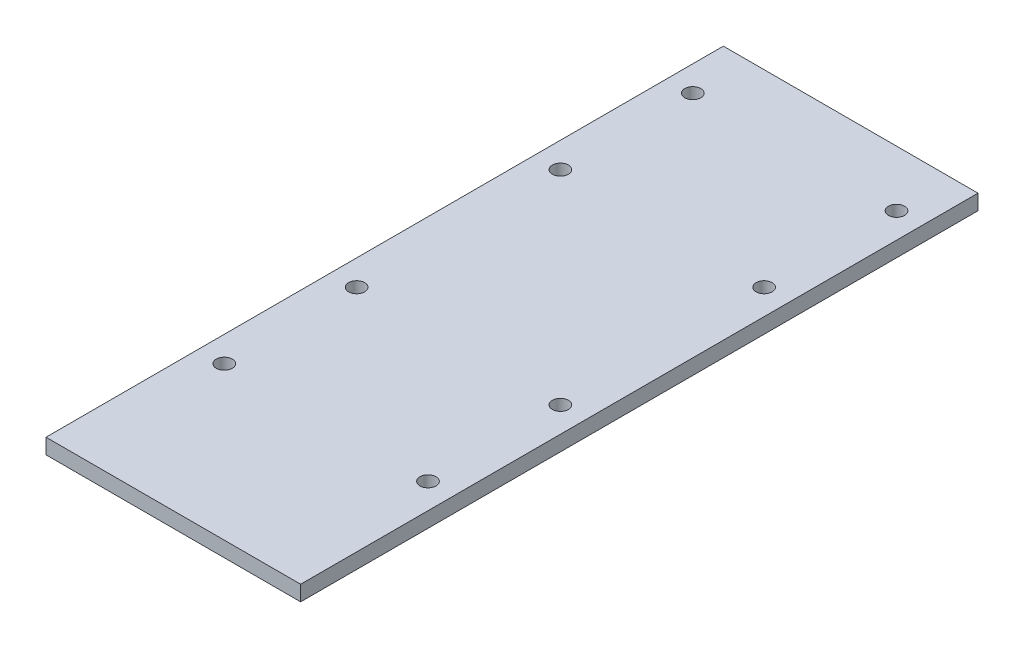
ISO-10303-21;
HEADER;
FILE_DESCRIPTION(('STEP AP214'),'2;1');
FILE_NAME('part.step','',(''),(''),'','','');
FILE_SCHEMA(('AUTOMOTIVE_DESIGN { 1 0 10303 214 1 1 1 1 }'));
ENDSEC;
DATA;
#1=APPLICATION_CONTEXT('core data for automotive mechanical design processes');
#2=APPLICATION_PROTOCOL_DEFINITION('international standard','automotive_design',2000,#1);
#3=PRODUCT_CONTEXT('',#1,'mechanical');
#4=PRODUCT('Part','Part','',(#3));
#5=PRODUCT_RELATED_PRODUCT_CATEGORY('part','',(#4));
#6=PRODUCT_DEFINITION_FORMATION('','',#4);
#7=PRODUCT_DEFINITION_CONTEXT('part definition',#1,'design');
#8=PRODUCT_DEFINITION('design','',#6,#7);
#9=PRODUCT_DEFINITION_SHAPE('','',#8);
#10=(LENGTH_UNIT() NAMED_UNIT(*) SI_UNIT(.MILLI.,.METRE.));
#11=(NAMED_UNIT(*) PLANE_ANGLE_UNIT() SI_UNIT($,.RADIAN.));
#12=(NAMED_UNIT(*) SI_UNIT($,.STERADIAN.) SOLID_ANGLE_UNIT());
#13=UNCERTAINTY_MEASURE_WITH_UNIT(LENGTH_MEASURE(1.E-05),#10,'distance_accuracy_value','');
#14=(GEOMETRIC_REPRESENTATION_CONTEXT(3) GLOBAL_UNCERTAINTY_ASSIGNED_CONTEXT((#13)) GLOBAL_UNIT_ASSIGNED_CONTEXT((#10,
#11,#12)) REPRESENTATION_CONTEXT('',''));
#15=CARTESIAN_POINT('',(0.,0.,0.));
#16=DIRECTION('',(0.,0.,1.));
#17=DIRECTION('',(1.,0.,0.));
#18=AXIS2_PLACEMENT_3D('',#15,#16,#17);
#19=CARTESIAN_POINT('',(0.,3.,0.));
#20=DIRECTION('',(0.,1.,0.));
#21=DIRECTION('',(0.,0.,1.));
#22=AXIS2_PLACEMENT_3D('',#19,#20,#21);
#23=PLANE('',#22);
#24=CARTESIAN_POINT('',(-20.,3.,-55.5));
#25=DIRECTION('',(0.,1.,0.));
#26=DIRECTION('',(0.,0.,1.));
#27=AXIS2_PLACEMENT_3D('',#24,#25,#26);
#28=CIRCLE('',#27,1.575);
#29=CARTESIAN_POINT('',(-20.,3.,-53.925));
#30=VERTEX_POINT('',#29);
#31=EDGE_CURVE('E148',#30,#30,#28,.T.);
#32=ORIENTED_EDGE('',*,*,#31,.F.);
#33=EDGE_LOOP('',(#32));
#34=FACE_BOUND('',#33,.T.);
#35=CARTESIAN_POINT('',(20.,3.,-29.5));
#36=DIRECTION('',(0.,1.,0.));
#37=DIRECTION('',(0.,0.,1.));
#38=AXIS2_PLACEMENT_3D('',#35,#36,#37);
#39=CIRCLE('',#38,1.575);
#40=CARTESIAN_POINT('',(20.,3.,-27.925));
#41=VERTEX_POINT('',#40);
#42=EDGE_CURVE('E136',#41,#41,#39,.T.);
#43=ORIENTED_EDGE('',*,*,#42,.F.);
#44=EDGE_LOOP('',(#43));
#45=FACE_BOUND('',#44,.T.);
#46=CARTESIAN_POINT('',(20.,3.,36.5));
#47=DIRECTION('',(0.,1.,0.));
#48=DIRECTION('',(0.,0.,1.));
#49=AXIS2_PLACEMENT_3D('',#46,#47,#48);
#50=CIRCLE('',#49,1.575);
#51=CARTESIAN_POINT('',(20.,3.,38.075));
#52=VERTEX_POINT('',#51);
#53=EDGE_CURVE('E124',#52,#52,#50,.T.);
#54=ORIENTED_EDGE('',*,*,#53,.F.);
#55=EDGE_LOOP('',(#54));
#56=FACE_BOUND('',#55,.T.);
#57=CARTESIAN_POINT('',(-20.,3.,10.5));
#58=DIRECTION('',(0.,1.,0.));
#59=DIRECTION('',(0.,0.,1.));
#60=AXIS2_PLACEMENT_3D('',#57,#58,#59);
#61=CIRCLE('',#60,1.575);
#62=CARTESIAN_POINT('',(-20.,3.,12.075));
#63=VERTEX_POINT('',#62);
#64=EDGE_CURVE('E103',#63,#63,#61,.T.);
#65=ORIENTED_EDGE('',*,*,#64,.F.);
#66=EDGE_LOOP('',(#65));
#67=FACE_BOUND('',#66,.T.);
#68=DIRECTION('',(0.,0.,-1.));
#69=VECTOR('',#68,1.);
#70=CARTESIAN_POINT('',(25.,3.,-66.5));
#71=LINE('',#70,#69);
#72=CARTESIAN_POINT('',(25.,3.,66.5));
#73=VERTEX_POINT('',#72);
#74=CARTESIAN_POINT('',(25.,3.,-66.5));
#75=VERTEX_POINT('',#74);
#76=EDGE_CURVE('E88',#73,#75,#71,.T.);
#77=ORIENTED_EDGE('',*,*,#76,.T.);
#78=DIRECTION('',(-1.,0.,0.));
#79=VECTOR('',#78,1.);
#80=CARTESIAN_POINT('',(-25.,3.,-66.5));
#81=LINE('',#80,#79);
#82=CARTESIAN_POINT('',(-25.,3.,-66.5));
#83=VERTEX_POINT('',#82);
#84=EDGE_CURVE('E83',#75,#83,#81,.T.);
#85=ORIENTED_EDGE('',*,*,#84,.T.);
#86=DIRECTION('',(0.,0.,1.));
#87=VECTOR('',#86,1.);
#88=CARTESIAN_POINT('',(-25.,3.,-66.5));
#89=LINE('',#88,#87);
#90=CARTESIAN_POINT('',(-25.,3.,66.5));
#91=VERTEX_POINT('',#90);
#92=EDGE_CURVE('E86',#83,#91,#89,.T.);
#93=ORIENTED_EDGE('',*,*,#92,.T.);
#94=DIRECTION('',(1.,0.,0.));
#95=VECTOR('',#94,1.);
#96=CARTESIAN_POINT('',(-25.,3.,66.5));
#97=LINE('',#96,#95);
#98=EDGE_CURVE('E53',#91,#73,#97,.T.);
#99=ORIENTED_EDGE('',*,*,#98,.T.);
#100=EDGE_LOOP('',(#77,#85,#93,#99));
#101=FACE_BOUND('',#100,.T.);
#102=CARTESIAN_POINT('',(-20.,3.,36.5));
#103=DIRECTION('',(0.,1.,0.));
#104=DIRECTION('',(0.,0.,1.));
#105=AXIS2_PLACEMENT_3D('',#102,#103,#104);
#106=CIRCLE('',#105,1.575);
#107=CARTESIAN_POINT('',(-20.,3.,38.075));
#108=VERTEX_POINT('',#107);
#109=EDGE_CURVE('E118',#108,#108,#106,.T.);
#110=ORIENTED_EDGE('',*,*,#109,.F.);
#111=EDGE_LOOP('',(#110));
#112=FACE_BOUND('',#111,.T.);
#113=CARTESIAN_POINT('',(20.,3.,10.5));
#114=DIRECTION('',(0.,1.,0.));
#115=DIRECTION('',(0.,0.,1.));
#116=AXIS2_PLACEMENT_3D('',#113,#114,#115);
#117=CIRCLE('',#116,1.575);
#118=CARTESIAN_POINT('',(20.,3.,12.075));
#119=VERTEX_POINT('',#118);
#120=EDGE_CURVE('E130',#119,#119,#117,.T.);
#121=ORIENTED_EDGE('',*,*,#120,.F.);
#122=EDGE_LOOP('',(#121));
#123=FACE_BOUND('',#122,.T.);
#124=CARTESIAN_POINT('',(-20.,3.,-29.5));
#125=DIRECTION('',(0.,1.,0.));
#126=DIRECTION('',(0.,0.,1.));
#127=AXIS2_PLACEMENT_3D('',#124,#125,#126);
#128=CIRCLE('',#127,1.575);
#129=CARTESIAN_POINT('',(-20.,3.,-27.925));
#130=VERTEX_POINT('',#129);
#131=EDGE_CURVE('E142',#130,#130,#128,.T.);
#132=ORIENTED_EDGE('',*,*,#131,.F.);
#133=EDGE_LOOP('',(#132));
#134=FACE_BOUND('',#133,.T.);
#135=CARTESIAN_POINT('',(20.,3.,-55.5));
#136=DIRECTION('',(0.,1.,0.));
#137=DIRECTION('',(0.,0.,1.));
#138=AXIS2_PLACEMENT_3D('',#135,#136,#137);
#139=CIRCLE('',#138,1.575);
#140=CARTESIAN_POINT('',(20.,3.,-53.925));
#141=VERTEX_POINT('',#140);
#142=EDGE_CURVE('E154',#141,#141,#139,.T.);
#143=ORIENTED_EDGE('',*,*,#142,.F.);
#144=EDGE_LOOP('',(#143));
#145=FACE_BOUND('',#144,.T.);
#146=ADVANCED_FACE('F36',(#34,#45,#56,#67,#101,#112,#123,#134,#145),#23,.T.);
#147=CARTESIAN_POINT('',(0.,0.,0.));
#148=DIRECTION('',(0.,1.,0.));
#149=DIRECTION('',(0.,0.,1.));
#150=AXIS2_PLACEMENT_3D('',#147,#148,#149);
#151=PLANE('',#150);
#152=DIRECTION('',(0.,0.,-1.));
#153=VECTOR('',#152,1.);
#154=CARTESIAN_POINT('',(25.,0.,-66.5));
#155=LINE('',#154,#153);
#156=CARTESIAN_POINT('',(25.,0.,66.5));
#157=VERTEX_POINT('',#156);
#158=CARTESIAN_POINT('',(25.,0.,-66.5));
#159=VERTEX_POINT('',#158);
#160=EDGE_CURVE('E100',#157,#159,#155,.T.);
#161=ORIENTED_EDGE('',*,*,#160,.F.);
#162=DIRECTION('',(1.,0.,0.));
#163=VECTOR('',#162,1.);
#164=CARTESIAN_POINT('',(-25.,0.,66.5));
#165=LINE('',#164,#163);
#166=CARTESIAN_POINT('',(-25.,0.,66.5));
#167=VERTEX_POINT('',#166);
#168=EDGE_CURVE('E76',#167,#157,#165,.T.);
#169=ORIENTED_EDGE('',*,*,#168,.F.);
#170=DIRECTION('',(0.,0.,1.));
#171=VECTOR('',#170,1.);
#172=CARTESIAN_POINT('',(-25.,0.,-66.5));
#173=LINE('',#172,#171);
#174=CARTESIAN_POINT('',(-25.,0.,-66.5));
#175=VERTEX_POINT('',#174);
#176=EDGE_CURVE('E70',#175,#167,#173,.T.);
#177=ORIENTED_EDGE('',*,*,#176,.F.);
#178=DIRECTION('',(-1.,0.,0.));
#179=VECTOR('',#178,1.);
#180=CARTESIAN_POINT('',(-25.,0.,-66.5));
#181=LINE('',#180,#179);
#182=EDGE_CURVE('E92',#159,#175,#181,.T.);
#183=ORIENTED_EDGE('',*,*,#182,.F.);
#184=EDGE_LOOP('',(#161,#169,#177,#183));
#185=FACE_BOUND('',#184,.T.);
#186=CARTESIAN_POINT('',(-20.,0.,10.5));
#187=DIRECTION('',(0.,1.,0.));
#188=DIRECTION('',(0.,0.,1.));
#189=AXIS2_PLACEMENT_3D('',#186,#187,#188);
#190=CIRCLE('',#189,1.575);
#191=CARTESIAN_POINT('',(-20.,0.,12.075));
#192=VERTEX_POINT('',#191);
#193=EDGE_CURVE('E115',#192,#192,#190,.T.);
#194=ORIENTED_EDGE('',*,*,#193,.T.);
#195=EDGE_LOOP('',(#194));
#196=FACE_BOUND('',#195,.T.);
#197=CARTESIAN_POINT('',(-20.,0.,36.5));
#198=DIRECTION('',(0.,1.,0.));
#199=DIRECTION('',(0.,0.,1.));
#200=AXIS2_PLACEMENT_3D('',#197,#198,#199);
#201=CIRCLE('',#200,1.575);
#202=CARTESIAN_POINT('',(-20.,0.,38.075));
#203=VERTEX_POINT('',#202);
#204=EDGE_CURVE('E121',#203,#203,#201,.T.);
#205=ORIENTED_EDGE('',*,*,#204,.T.);
#206=EDGE_LOOP('',(#205));
#207=FACE_BOUND('',#206,.T.);
#208=CARTESIAN_POINT('',(20.,0.,36.5));
#209=DIRECTION('',(0.,1.,0.));
#210=DIRECTION('',(0.,0.,1.));
#211=AXIS2_PLACEMENT_3D('',#208,#209,#210);
#212=CIRCLE('',#211,1.575);
#213=CARTESIAN_POINT('',(20.,0.,38.075));
#214=VERTEX_POINT('',#213);
#215=EDGE_CURVE('E127',#214,#214,#212,.T.);
#216=ORIENTED_EDGE('',*,*,#215,.T.);
#217=EDGE_LOOP('',(#216));
#218=FACE_BOUND('',#217,.T.);
#219=CARTESIAN_POINT('',(20.,0.,10.5));
#220=DIRECTION('',(0.,1.,0.));
#221=DIRECTION('',(0.,0.,1.));
#222=AXIS2_PLACEMENT_3D('',#219,#220,#221);
#223=CIRCLE('',#222,1.575);
#224=CARTESIAN_POINT('',(20.,0.,12.075));
#225=VERTEX_POINT('',#224);
#226=EDGE_CURVE('E133',#225,#225,#223,.T.);
#227=ORIENTED_EDGE('',*,*,#226,.T.);
#228=EDGE_LOOP('',(#227));
#229=FACE_BOUND('',#228,.T.);
#230=CARTESIAN_POINT('',(20.,0.,-29.5));
#231=DIRECTION('',(0.,1.,0.));
#232=DIRECTION('',(0.,0.,1.));
#233=AXIS2_PLACEMENT_3D('',#230,#231,#232);
#234=CIRCLE('',#233,1.575);
#235=CARTESIAN_POINT('',(20.,0.,-27.925));
#236=VERTEX_POINT('',#235);
#237=EDGE_CURVE('E139',#236,#236,#234,.T.);
#238=ORIENTED_EDGE('',*,*,#237,.T.);
#239=EDGE_LOOP('',(#238));
#240=FACE_BOUND('',#239,.T.);
#241=CARTESIAN_POINT('',(-20.,0.,-29.5));
#242=DIRECTION('',(0.,1.,0.));
#243=DIRECTION('',(0.,0.,1.));
#244=AXIS2_PLACEMENT_3D('',#241,#242,#243);
#245=CIRCLE('',#244,1.575);
#246=CARTESIAN_POINT('',(-20.,0.,-27.925));
#247=VERTEX_POINT('',#246);
#248=EDGE_CURVE('E145',#247,#247,#245,.T.);
#249=ORIENTED_EDGE('',*,*,#248,.T.);
#250=EDGE_LOOP('',(#249));
#251=FACE_BOUND('',#250,.T.);
#252=CARTESIAN_POINT('',(-20.,0.,-55.5));
#253=DIRECTION('',(0.,1.,0.));
#254=DIRECTION('',(0.,0.,1.));
#255=AXIS2_PLACEMENT_3D('',#252,#253,#254);
#256=CIRCLE('',#255,1.575);
#257=CARTESIAN_POINT('',(-20.,0.,-53.925));
#258=VERTEX_POINT('',#257);
#259=EDGE_CURVE('E151',#258,#258,#256,.T.);
#260=ORIENTED_EDGE('',*,*,#259,.T.);
#261=EDGE_LOOP('',(#260));
#262=FACE_BOUND('',#261,.T.);
#263=CARTESIAN_POINT('',(20.,0.,-55.5));
#264=DIRECTION('',(0.,1.,0.));
#265=DIRECTION('',(0.,0.,1.));
#266=AXIS2_PLACEMENT_3D('',#263,#264,#265);
#267=CIRCLE('',#266,1.575);
#268=CARTESIAN_POINT('',(20.,0.,-53.925));
#269=VERTEX_POINT('',#268);
#270=EDGE_CURVE('E157',#269,#269,#267,.T.);
#271=ORIENTED_EDGE('',*,*,#270,.T.);
#272=EDGE_LOOP('',(#271));
#273=FACE_BOUND('',#272,.T.);
#274=ADVANCED_FACE('F111',(#185,#196,#207,#218,#229,#240,#251,#262,#273),#151,.F.);
#275=CARTESIAN_POINT('',(25.,3.,-66.5));
#276=DIRECTION('',(-1.,0.,0.));
#277=DIRECTION('',(0.,0.,1.));
#278=AXIS2_PLACEMENT_3D('',#275,#276,#277);
#279=PLANE('',#278);
#280=ORIENTED_EDGE('',*,*,#160,.T.);
#281=DIRECTION('',(0.,-1.,0.));
#282=VECTOR('',#281,1.);
#283=CARTESIAN_POINT('',(25.,3.,-66.5));
#284=LINE('',#283,#282);
#285=EDGE_CURVE('E11',#75,#159,#284,.T.);
#286=ORIENTED_EDGE('',*,*,#285,.F.);
#287=ORIENTED_EDGE('',*,*,#76,.F.);
#288=DIRECTION('',(0.,-1.,0.));
#289=VECTOR('',#288,1.);
#290=CARTESIAN_POINT('',(25.,3.,66.5));
#291=LINE('',#290,#289);
#292=EDGE_CURVE('E96',#73,#157,#291,.T.);
#293=ORIENTED_EDGE('',*,*,#292,.T.);
#294=EDGE_LOOP('',(#280,#286,#287,#293));
#295=FACE_BOUND('',#294,.T.);
#296=ADVANCED_FACE('F38',(#295),#279,.F.);
#297=CARTESIAN_POINT('',(-25.,3.,-66.5));
#298=DIRECTION('',(0.,0.,1.));
#299=DIRECTION('',(1.,0.,0.));
#300=AXIS2_PLACEMENT_3D('',#297,#298,#299);
#301=PLANE('',#300);
#302=ORIENTED_EDGE('',*,*,#182,.T.);
#303=DIRECTION('',(0.,-1.,0.));
#304=VECTOR('',#303,1.);
#305=CARTESIAN_POINT('',(-25.,3.,-66.5));
#306=LINE('',#305,#304);
#307=EDGE_CURVE('E45',#83,#175,#306,.T.);
#308=ORIENTED_EDGE('',*,*,#307,.F.);
#309=ORIENTED_EDGE('',*,*,#84,.F.);
#310=ORIENTED_EDGE('',*,*,#285,.T.);
#311=EDGE_LOOP('',(#302,#308,#309,#310));
#312=FACE_BOUND('',#311,.T.);
#313=ADVANCED_FACE('F91',(#312),#301,.F.);
#314=CARTESIAN_POINT('',(-25.,3.,-66.5));
#315=DIRECTION('',(1.,0.,0.));
#316=DIRECTION('',(0.,0.,-1.));
#317=AXIS2_PLACEMENT_3D('',#314,#315,#316);
#318=PLANE('',#317);
#319=ORIENTED_EDGE('',*,*,#176,.T.);
#320=DIRECTION('',(0.,-1.,0.));
#321=VECTOR('',#320,1.);
#322=CARTESIAN_POINT('',(-25.,3.,66.5));
#323=LINE('',#322,#321);
#324=EDGE_CURVE('E93',#91,#167,#323,.T.);
#325=ORIENTED_EDGE('',*,*,#324,.F.);
#326=ORIENTED_EDGE('',*,*,#92,.F.);
#327=ORIENTED_EDGE('',*,*,#307,.T.);
#328=EDGE_LOOP('',(#319,#325,#326,#327));
#329=FACE_BOUND('',#328,.T.);
#330=ADVANCED_FACE('F94',(#329),#318,.F.);
#331=CARTESIAN_POINT('',(-25.,3.,66.5));
#332=DIRECTION('',(0.,0.,-1.));
#333=DIRECTION('',(-1.,0.,0.));
#334=AXIS2_PLACEMENT_3D('',#331,#332,#333);
#335=PLANE('',#334);
#336=ORIENTED_EDGE('',*,*,#168,.T.);
#337=ORIENTED_EDGE('',*,*,#292,.F.);
#338=ORIENTED_EDGE('',*,*,#98,.F.);
#339=ORIENTED_EDGE('',*,*,#324,.T.);
#340=EDGE_LOOP('',(#336,#337,#338,#339));
#341=FACE_BOUND('',#340,.T.);
#342=ADVANCED_FACE('F108',(#341),#335,.F.);
#343=CARTESIAN_POINT('',(-20.,3.,10.5));
#344=DIRECTION('',(0.,-1.,0.));
#345=DIRECTION('',(0.,0.,-1.));
#346=AXIS2_PLACEMENT_3D('',#343,#344,#345);
#347=CYLINDRICAL_SURFACE('',#346,1.575);
#348=ORIENTED_EDGE('',*,*,#64,.T.);
#349=EDGE_LOOP('',(#348));
#350=FACE_BOUND('',#349,.T.);
#351=ORIENTED_EDGE('',*,*,#193,.F.);
#352=EDGE_LOOP('',(#351));
#353=FACE_BOUND('',#352,.T.);
#354=ADVANCED_FACE('F176',(#350,#353),#347,.F.);
#355=CARTESIAN_POINT('',(-20.,3.,36.5));
#356=DIRECTION('',(0.,-1.,0.));
#357=DIRECTION('',(0.,0.,-1.));
#358=AXIS2_PLACEMENT_3D('',#355,#356,#357);
#359=CYLINDRICAL_SURFACE('',#358,1.575);
#360=ORIENTED_EDGE('',*,*,#109,.T.);
#361=EDGE_LOOP('',(#360));
#362=FACE_BOUND('',#361,.T.);
#363=ORIENTED_EDGE('',*,*,#204,.F.);
#364=EDGE_LOOP('',(#363));
#365=FACE_BOUND('',#364,.T.);
#366=ADVANCED_FACE('F222',(#362,#365),#359,.F.);
#367=CARTESIAN_POINT('',(20.,3.,36.5));
#368=DIRECTION('',(0.,-1.,0.));
#369=DIRECTION('',(0.,0.,-1.));
#370=AXIS2_PLACEMENT_3D('',#367,#368,#369);
#371=CYLINDRICAL_SURFACE('',#370,1.575);
#372=ORIENTED_EDGE('',*,*,#53,.T.);
#373=EDGE_LOOP('',(#372));
#374=FACE_BOUND('',#373,.T.);
#375=ORIENTED_EDGE('',*,*,#215,.F.);
#376=EDGE_LOOP('',(#375));
#377=FACE_BOUND('',#376,.T.);
#378=ADVANCED_FACE('F230',(#374,#377),#371,.F.);
#379=CARTESIAN_POINT('',(20.,3.,10.5));
#380=DIRECTION('',(0.,-1.,0.));
#381=DIRECTION('',(0.,0.,-1.));
#382=AXIS2_PLACEMENT_3D('',#379,#380,#381);
#383=CYLINDRICAL_SURFACE('',#382,1.575);
#384=ORIENTED_EDGE('',*,*,#120,.T.);
#385=EDGE_LOOP('',(#384));
#386=FACE_BOUND('',#385,.T.);
#387=ORIENTED_EDGE('',*,*,#226,.F.);
#388=EDGE_LOOP('',(#387));
#389=FACE_BOUND('',#388,.T.);
#390=ADVANCED_FACE('F238',(#386,#389),#383,.F.);
#391=CARTESIAN_POINT('',(20.,3.,-29.5));
#392=DIRECTION('',(0.,-1.,0.));
#393=DIRECTION('',(0.,0.,-1.));
#394=AXIS2_PLACEMENT_3D('',#391,#392,#393);
#395=CYLINDRICAL_SURFACE('',#394,1.575);
#396=ORIENTED_EDGE('',*,*,#42,.T.);
#397=EDGE_LOOP('',(#396));
#398=FACE_BOUND('',#397,.T.);
#399=ORIENTED_EDGE('',*,*,#237,.F.);
#400=EDGE_LOOP('',(#399));
#401=FACE_BOUND('',#400,.T.);
#402=ADVANCED_FACE('F247',(#398,#401),#395,.F.);
#403=CARTESIAN_POINT('',(-20.,3.,-29.5));
#404=DIRECTION('',(0.,-1.,0.));
#405=DIRECTION('',(0.,0.,-1.));
#406=AXIS2_PLACEMENT_3D('',#403,#404,#405);
#407=CYLINDRICAL_SURFACE('',#406,1.575);
#408=ORIENTED_EDGE('',*,*,#131,.T.);
#409=EDGE_LOOP('',(#408));
#410=FACE_BOUND('',#409,.T.);
#411=ORIENTED_EDGE('',*,*,#248,.F.);
#412=EDGE_LOOP('',(#411));
#413=FACE_BOUND('',#412,.T.);
#414=ADVANCED_FACE('F256',(#410,#413),#407,.F.);
#415=CARTESIAN_POINT('',(-20.,3.,-55.5));
#416=DIRECTION('',(0.,-1.,0.));
#417=DIRECTION('',(0.,0.,-1.));
#418=AXIS2_PLACEMENT_3D('',#415,#416,#417);
#419=CYLINDRICAL_SURFACE('',#418,1.575);
#420=ORIENTED_EDGE('',*,*,#31,.T.);
#421=EDGE_LOOP('',(#420));
#422=FACE_BOUND('',#421,.T.);
#423=ORIENTED_EDGE('',*,*,#259,.F.);
#424=EDGE_LOOP('',(#423));
#425=FACE_BOUND('',#424,.T.);
#426=ADVANCED_FACE('F265',(#422,#425),#419,.F.);
#427=CARTESIAN_POINT('',(20.,3.,-55.5));
#428=DIRECTION('',(0.,-1.,0.));
#429=DIRECTION('',(0.,0.,-1.));
#430=AXIS2_PLACEMENT_3D('',#427,#428,#429);
#431=CYLINDRICAL_SURFACE('',#430,1.575);
#432=ORIENTED_EDGE('',*,*,#142,.T.);
#433=EDGE_LOOP('',(#432));
#434=FACE_BOUND('',#433,.T.);
#435=ORIENTED_EDGE('',*,*,#270,.F.);
#436=EDGE_LOOP('',(#435));
#437=FACE_BOUND('',#436,.T.);
#438=ADVANCED_FACE('F163',(#434,#437),#431,.F.);
#439=CLOSED_SHELL('',(#146,#274,#296,#313,#330,#342,#354,#366,#378,#390,#402,#414,#426,#438));
#440=MANIFOLD_SOLID_BREP('B2',#439);
#441=ADVANCED_BREP_SHAPE_REPRESENTATION('',(#18,#440),#14);
#442=SHAPE_DEFINITION_REPRESENTATION(#9,#441);
ENDSEC;
END-ISO-10303-21;
